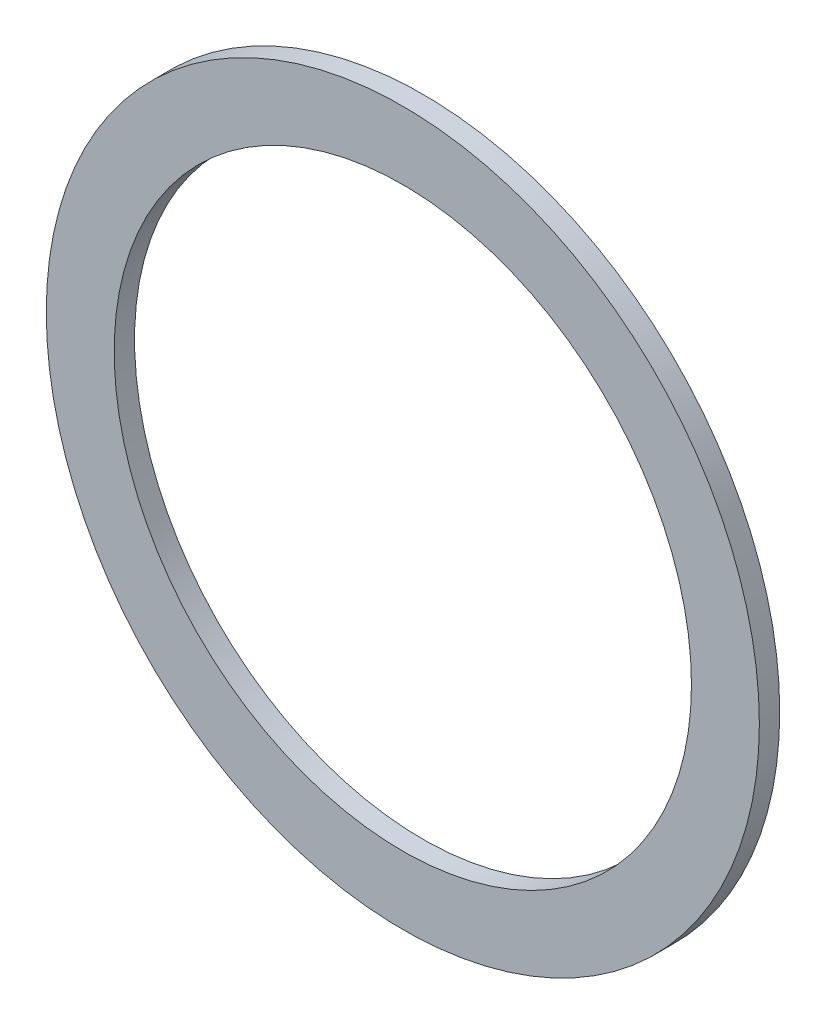
ISO-10303-21;
HEADER;
FILE_DESCRIPTION(('STEP AP214'),'2;1');
FILE_NAME('part.step','',(''),(''),'','','');
FILE_SCHEMA(('AUTOMOTIVE_DESIGN { 1 0 10303 214 1 1 1 1 }'));
ENDSEC;
DATA;
#1=APPLICATION_CONTEXT('core data for automotive mechanical design processes');
#2=APPLICATION_PROTOCOL_DEFINITION('international standard','automotive_design',2000,#1);
#3=PRODUCT_CONTEXT('',#1,'mechanical');
#4=PRODUCT('Part','Part','',(#3));
#5=PRODUCT_RELATED_PRODUCT_CATEGORY('part','',(#4));
#6=PRODUCT_DEFINITION_FORMATION('','',#4);
#7=PRODUCT_DEFINITION_CONTEXT('part definition',#1,'design');
#8=PRODUCT_DEFINITION('design','',#6,#7);
#9=PRODUCT_DEFINITION_SHAPE('','',#8);
#10=(LENGTH_UNIT() NAMED_UNIT(*) SI_UNIT(.MILLI.,.METRE.));
#11=(NAMED_UNIT(*) PLANE_ANGLE_UNIT() SI_UNIT($,.RADIAN.));
#12=(NAMED_UNIT(*) SI_UNIT($,.STERADIAN.) SOLID_ANGLE_UNIT());
#13=UNCERTAINTY_MEASURE_WITH_UNIT(LENGTH_MEASURE(1.E-05),#10,'distance_accuracy_value','');
#14=(GEOMETRIC_REPRESENTATION_CONTEXT(3) GLOBAL_UNCERTAINTY_ASSIGNED_CONTEXT((#13)) GLOBAL_UNIT_ASSIGNED_CONTEXT((#10,
#11,#12)) REPRESENTATION_CONTEXT('',''));
#15=CARTESIAN_POINT('',(0.,0.,0.));
#16=DIRECTION('',(0.,0.,1.));
#17=DIRECTION('',(1.,0.,0.));
#18=AXIS2_PLACEMENT_3D('',#15,#16,#17);
#19=CARTESIAN_POINT('',(0.,0.,0.06));
#20=DIRECTION('',(0.,0.,1.));
#21=DIRECTION('',(1.,0.,0.));
#22=AXIS2_PLACEMENT_3D('',#19,#20,#21);
#23=PLANE('',#22);
#24=CARTESIAN_POINT('',(0.,0.,0.06));
#25=DIRECTION('',(0.,0.,1.));
#26=DIRECTION('',(1.,0.,0.));
#27=AXIS2_PLACEMENT_3D('',#24,#25,#26);
#28=CIRCLE('',#27,1.05);
#29=CARTESIAN_POINT('',(1.05,0.,0.06));
#30=VERTEX_POINT('',#29);
#31=EDGE_CURVE('E10',#30,#30,#28,.T.);
#32=ORIENTED_EDGE('',*,*,#31,.T.);
#33=EDGE_LOOP('',(#32));
#34=FACE_BOUND('',#33,.T.);
#35=CARTESIAN_POINT('',(0.,0.,0.06));
#36=DIRECTION('',(0.,0.,1.));
#37=DIRECTION('',(1.,0.,0.));
#38=AXIS2_PLACEMENT_3D('',#35,#36,#37);
#39=CIRCLE('',#38,0.849999999999997);
#40=CARTESIAN_POINT('',(0.849999999999997,0.,0.06));
#41=VERTEX_POINT('',#40);
#42=EDGE_CURVE('E49',#41,#41,#39,.T.);
#43=ORIENTED_EDGE('',*,*,#42,.F.);
#44=EDGE_LOOP('',(#43));
#45=FACE_BOUND('',#44,.T.);
#46=ADVANCED_FACE('F38',(#34,#45),#23,.T.);
#47=CARTESIAN_POINT('',(0.,0.,0.));
#48=DIRECTION('',(0.,0.,1.));
#49=DIRECTION('',(1.,0.,0.));
#50=AXIS2_PLACEMENT_3D('',#47,#48,#49);
#51=PLANE('',#50);
#52=CARTESIAN_POINT('',(0.,0.,0.));
#53=DIRECTION('',(0.,0.,1.));
#54=DIRECTION('',(1.,0.,0.));
#55=AXIS2_PLACEMENT_3D('',#52,#53,#54);
#56=CIRCLE('',#55,1.05);
#57=CARTESIAN_POINT('',(1.05,0.,0.));
#58=VERTEX_POINT('',#57);
#59=EDGE_CURVE('E42',#58,#58,#56,.T.);
#60=ORIENTED_EDGE('',*,*,#59,.F.);
#61=EDGE_LOOP('',(#60));
#62=FACE_BOUND('',#61,.T.);
#63=CARTESIAN_POINT('',(0.,0.,0.));
#64=DIRECTION('',(0.,0.,1.));
#65=DIRECTION('',(1.,0.,0.));
#66=AXIS2_PLACEMENT_3D('',#63,#64,#65);
#67=CIRCLE('',#66,0.849999999999997);
#68=CARTESIAN_POINT('',(0.849999999999997,0.,0.));
#69=VERTEX_POINT('',#68);
#70=EDGE_CURVE('E51',#69,#69,#67,.T.);
#71=ORIENTED_EDGE('',*,*,#70,.T.);
#72=EDGE_LOOP('',(#71));
#73=FACE_BOUND('',#72,.T.);
#74=ADVANCED_FACE('F61',(#62,#73),#51,.F.);
#75=CARTESIAN_POINT('',(0.,0.,0.06));
#76=DIRECTION('',(0.,0.,-1.));
#77=DIRECTION('',(-1.,0.,0.));
#78=AXIS2_PLACEMENT_3D('',#75,#76,#77);
#79=CYLINDRICAL_SURFACE('',#78,1.05);
#80=ORIENTED_EDGE('',*,*,#31,.F.);
#81=EDGE_LOOP('',(#80));
#82=FACE_BOUND('',#81,.T.);
#83=ORIENTED_EDGE('',*,*,#59,.T.);
#84=EDGE_LOOP('',(#83));
#85=FACE_BOUND('',#84,.T.);
#86=ADVANCED_FACE('F40',(#82,#85),#79,.T.);
#87=CARTESIAN_POINT('',(0.,0.,0.06));
#88=DIRECTION('',(0.,0.,-1.));
#89=DIRECTION('',(-1.,0.,0.));
#90=AXIS2_PLACEMENT_3D('',#87,#88,#89);
#91=CYLINDRICAL_SURFACE('',#90,0.849999999999997);
#92=ORIENTED_EDGE('',*,*,#42,.T.);
#93=EDGE_LOOP('',(#92));
#94=FACE_BOUND('',#93,.T.);
#95=ORIENTED_EDGE('',*,*,#70,.F.);
#96=EDGE_LOOP('',(#95));
#97=FACE_BOUND('',#96,.T.);
#98=ADVANCED_FACE('F57',(#94,#97),#91,.F.);
#99=CLOSED_SHELL('',(#46,#74,#86,#98));
#100=MANIFOLD_SOLID_BREP('B2',#99);
#101=ADVANCED_BREP_SHAPE_REPRESENTATION('',(#18,#100),#14);
#102=SHAPE_DEFINITION_REPRESENTATION(#9,#101);
ENDSEC;
END-ISO-10303-21;
